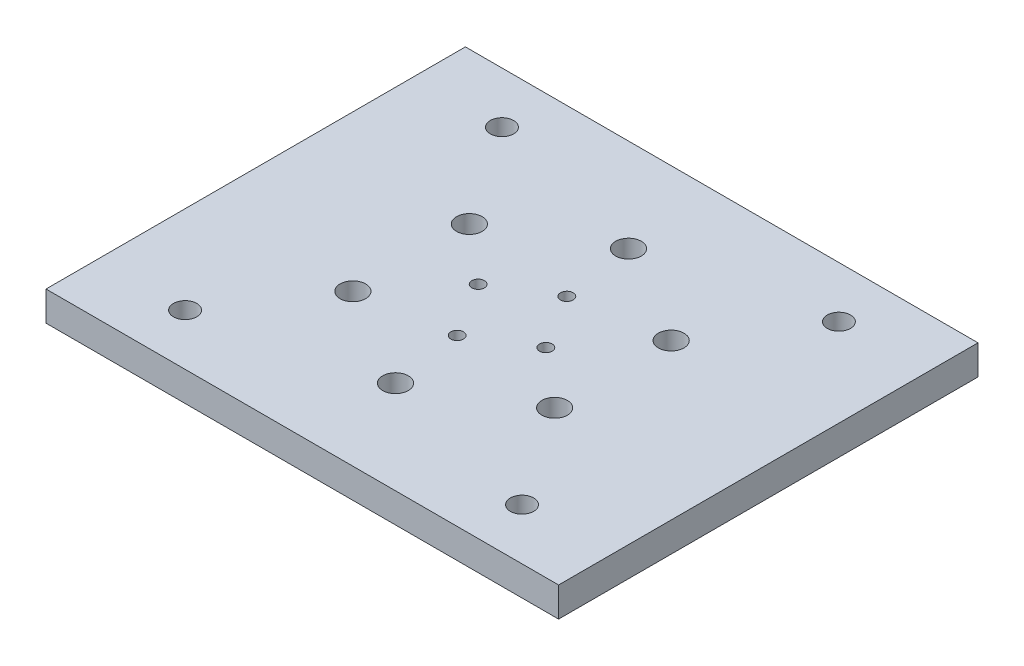
ISO-10303-21;
HEADER;
FILE_DESCRIPTION(('STEP AP214'),'2;1');
FILE_NAME('part.step','',(''),(''),'','','');
FILE_SCHEMA(('AUTOMOTIVE_DESIGN { 1 0 10303 214 1 1 1 1 }'));
ENDSEC;
DATA;
#1=APPLICATION_CONTEXT('core data for automotive mechanical design processes');
#2=APPLICATION_PROTOCOL_DEFINITION('international standard','automotive_design',2000,#1);
#3=PRODUCT_CONTEXT('',#1,'mechanical');
#4=PRODUCT('Part','Part','',(#3));
#5=PRODUCT_RELATED_PRODUCT_CATEGORY('part','',(#4));
#6=PRODUCT_DEFINITION_FORMATION('','',#4);
#7=PRODUCT_DEFINITION_CONTEXT('part definition',#1,'design');
#8=PRODUCT_DEFINITION('design','',#6,#7);
#9=PRODUCT_DEFINITION_SHAPE('','',#8);
#10=(LENGTH_UNIT() NAMED_UNIT(*) SI_UNIT(.MILLI.,.METRE.));
#11=(NAMED_UNIT(*) PLANE_ANGLE_UNIT() SI_UNIT($,.RADIAN.));
#12=(NAMED_UNIT(*) SI_UNIT($,.STERADIAN.) SOLID_ANGLE_UNIT());
#13=UNCERTAINTY_MEASURE_WITH_UNIT(LENGTH_MEASURE(1.E-05),#10,'distance_accuracy_value','');
#14=(GEOMETRIC_REPRESENTATION_CONTEXT(3) GLOBAL_UNCERTAINTY_ASSIGNED_CONTEXT((#13)) GLOBAL_UNIT_ASSIGNED_CONTEXT((#10,
#11,#12)) REPRESENTATION_CONTEXT('',''));
#15=CARTESIAN_POINT('',(0.,0.,0.));
#16=DIRECTION('',(0.,0.,1.));
#17=DIRECTION('',(1.,0.,0.));
#18=AXIS2_PLACEMENT_3D('',#15,#16,#17);
#19=CARTESIAN_POINT('',(110.,6.35,0.));
#20=DIRECTION('',(0.,0.,-1.));
#21=DIRECTION('',(-1.,0.,0.));
#22=AXIS2_PLACEMENT_3D('',#19,#20,#21);
#23=PLANE('',#22);
#24=DIRECTION('',(1.,0.,0.));
#25=VECTOR('',#24,1.);
#26=CARTESIAN_POINT('',(110.,0.,0.));
#27=LINE('',#26,#25);
#28=CARTESIAN_POINT('',(0.,0.,0.));
#29=VERTEX_POINT('',#28);
#30=CARTESIAN_POINT('',(110.,0.,0.));
#31=VERTEX_POINT('',#30);
#32=EDGE_CURVE('E103',#29,#31,#27,.T.);
#33=ORIENTED_EDGE('',*,*,#32,.T.);
#34=DIRECTION('',(0.,-1.,0.));
#35=VECTOR('',#34,1.);
#36=CARTESIAN_POINT('',(110.,6.35,0.));
#37=LINE('',#36,#35);
#38=CARTESIAN_POINT('',(110.,6.35,0.));
#39=VERTEX_POINT('',#38);
#40=EDGE_CURVE('E11',#39,#31,#37,.T.);
#41=ORIENTED_EDGE('',*,*,#40,.F.);
#42=DIRECTION('',(1.,0.,0.));
#43=VECTOR('',#42,1.);
#44=CARTESIAN_POINT('',(110.,6.35,0.));
#45=LINE('',#44,#43);
#46=CARTESIAN_POINT('',(0.,6.35,0.));
#47=VERTEX_POINT('',#46);
#48=EDGE_CURVE('E91',#47,#39,#45,.T.);
#49=ORIENTED_EDGE('',*,*,#48,.F.);
#50=DIRECTION('',(0.,-1.,0.));
#51=VECTOR('',#50,1.);
#52=CARTESIAN_POINT('',(0.,6.35,0.));
#53=LINE('',#52,#51);
#54=EDGE_CURVE('E99',#47,#29,#53,.T.);
#55=ORIENTED_EDGE('',*,*,#54,.T.);
#56=EDGE_LOOP('',(#33,#41,#49,#55));
#57=FACE_BOUND('',#56,.T.);
#58=ADVANCED_FACE('F40',(#57),#23,.F.);
#59=CARTESIAN_POINT('',(110.,6.35,-90.));
#60=DIRECTION('',(-1.,0.,0.));
#61=DIRECTION('',(0.,0.,1.));
#62=AXIS2_PLACEMENT_3D('',#59,#60,#61);
#63=PLANE('',#62);
#64=DIRECTION('',(0.,0.,-1.));
#65=VECTOR('',#64,1.);
#66=CARTESIAN_POINT('',(110.,0.,-90.));
#67=LINE('',#66,#65);
#68=CARTESIAN_POINT('',(110.,0.,-90.));
#69=VERTEX_POINT('',#68);
#70=EDGE_CURVE('E95',#31,#69,#67,.T.);
#71=ORIENTED_EDGE('',*,*,#70,.T.);
#72=DIRECTION('',(0.,-1.,0.));
#73=VECTOR('',#72,1.);
#74=CARTESIAN_POINT('',(110.,6.35,-90.));
#75=LINE('',#74,#73);
#76=CARTESIAN_POINT('',(110.,6.35,-90.));
#77=VERTEX_POINT('',#76);
#78=EDGE_CURVE('E48',#77,#69,#75,.T.);
#79=ORIENTED_EDGE('',*,*,#78,.F.);
#80=DIRECTION('',(0.,0.,-1.));
#81=VECTOR('',#80,1.);
#82=CARTESIAN_POINT('',(110.,6.35,-90.));
#83=LINE('',#82,#81);
#84=EDGE_CURVE('E86',#39,#77,#83,.T.);
#85=ORIENTED_EDGE('',*,*,#84,.F.);
#86=ORIENTED_EDGE('',*,*,#40,.T.);
#87=EDGE_LOOP('',(#71,#79,#85,#86));
#88=FACE_BOUND('',#87,.T.);
#89=ADVANCED_FACE('F94',(#88),#63,.F.);
#90=CARTESIAN_POINT('',(0.,6.35,-90.));
#91=DIRECTION('',(0.,0.,1.));
#92=DIRECTION('',(1.,0.,0.));
#93=AXIS2_PLACEMENT_3D('',#90,#91,#92);
#94=PLANE('',#93);
#95=DIRECTION('',(-1.,0.,0.));
#96=VECTOR('',#95,1.);
#97=CARTESIAN_POINT('',(0.,0.,-90.));
#98=LINE('',#97,#96);
#99=CARTESIAN_POINT('',(0.,0.,-90.));
#100=VERTEX_POINT('',#99);
#101=EDGE_CURVE('E73',#69,#100,#98,.T.);
#102=ORIENTED_EDGE('',*,*,#101,.T.);
#103=DIRECTION('',(0.,-1.,0.));
#104=VECTOR('',#103,1.);
#105=CARTESIAN_POINT('',(0.,6.35,-90.));
#106=LINE('',#105,#104);
#107=CARTESIAN_POINT('',(0.,6.35,-90.));
#108=VERTEX_POINT('',#107);
#109=EDGE_CURVE('E96',#108,#100,#106,.T.);
#110=ORIENTED_EDGE('',*,*,#109,.F.);
#111=DIRECTION('',(-1.,0.,0.));
#112=VECTOR('',#111,1.);
#113=CARTESIAN_POINT('',(0.,6.35,-90.));
#114=LINE('',#113,#112);
#115=EDGE_CURVE('E89',#77,#108,#114,.T.);
#116=ORIENTED_EDGE('',*,*,#115,.F.);
#117=ORIENTED_EDGE('',*,*,#78,.T.);
#118=EDGE_LOOP('',(#102,#110,#116,#117));
#119=FACE_BOUND('',#118,.T.);
#120=ADVANCED_FACE('F97',(#119),#94,.F.);
#121=CARTESIAN_POINT('',(0.,6.35,0.));
#122=DIRECTION('',(1.,0.,0.));
#123=DIRECTION('',(0.,0.,-1.));
#124=AXIS2_PLACEMENT_3D('',#121,#122,#123);
#125=PLANE('',#124);
#126=DIRECTION('',(0.,0.,1.));
#127=VECTOR('',#126,1.);
#128=CARTESIAN_POINT('',(0.,0.,0.));
#129=LINE('',#128,#127);
#130=EDGE_CURVE('E79',#100,#29,#129,.T.);
#131=ORIENTED_EDGE('',*,*,#130,.T.);
#132=ORIENTED_EDGE('',*,*,#54,.F.);
#133=DIRECTION('',(0.,0.,1.));
#134=VECTOR('',#133,1.);
#135=CARTESIAN_POINT('',(0.,6.35,0.));
#136=LINE('',#135,#134);
#137=EDGE_CURVE('E56',#108,#47,#136,.T.);
#138=ORIENTED_EDGE('',*,*,#137,.F.);
#139=ORIENTED_EDGE('',*,*,#109,.T.);
#140=EDGE_LOOP('',(#131,#132,#138,#139));
#141=FACE_BOUND('',#140,.T.);
#142=ADVANCED_FACE('F111',(#141),#125,.F.);
#143=CARTESIAN_POINT('',(0.,6.35,0.));
#144=DIRECTION('',(0.,-1.,0.));
#145=DIRECTION('',(0.,0.,-1.));
#146=AXIS2_PLACEMENT_3D('',#143,#144,#145);
#147=PLANE('',#146);
#148=CARTESIAN_POINT('',(64.5161699743969,6.35,-42.7480341888413));
#149=DIRECTION('',(0.,1.,0.));
#150=DIRECTION('',(0.,0.,1.));
#151=AXIS2_PLACEMENT_3D('',#148,#149,#150);
#152=CIRCLE('',#151,1.355);
#153=CARTESIAN_POINT('',(64.5161699743969,6.35,-41.3930341888413));
#154=VERTEX_POINT('',#153);
#155=EDGE_CURVE('E170',#154,#154,#152,.T.);
#156=ORIENTED_EDGE('',*,*,#155,.F.);
#157=EDGE_LOOP('',(#156));
#158=FACE_BOUND('',#157,.T.);
#159=CARTESIAN_POINT('',(45.4838300246016,6.35,-47.251965808596));
#160=DIRECTION('',(0.,1.,0.));
#161=DIRECTION('',(0.,0.,1.));
#162=AXIS2_PLACEMENT_3D('',#159,#160,#161);
#163=CIRCLE('',#162,1.355);
#164=CARTESIAN_POINT('',(45.4838300246016,6.35,-45.896965808596));
#165=VERTEX_POINT('',#164);
#166=EDGE_CURVE('E189',#165,#165,#163,.T.);
#167=ORIENTED_EDGE('',*,*,#166,.F.);
#168=EDGE_LOOP('',(#167));
#169=FACE_BOUND('',#168,.T.);
#170=CARTESIAN_POINT('',(57.2519658093765,6.35,-54.5161699736163));
#171=DIRECTION('',(0.,1.,0.));
#172=DIRECTION('',(0.,0.,1.));
#173=AXIS2_PLACEMENT_3D('',#170,#171,#172);
#174=CIRCLE('',#173,1.355);
#175=CARTESIAN_POINT('',(57.2519658093765,6.35,-53.1611699736163));
#176=VERTEX_POINT('',#175);
#177=EDGE_CURVE('E183',#176,#176,#174,.T.);
#178=ORIENTED_EDGE('',*,*,#177,.F.);
#179=EDGE_LOOP('',(#178));
#180=FACE_BOUND('',#179,.T.);
#181=CARTESIAN_POINT('',(52.748034189622,6.35,-35.4838300238209));
#182=DIRECTION('',(0.,1.,0.));
#183=DIRECTION('',(0.,0.,1.));
#184=AXIS2_PLACEMENT_3D('',#181,#182,#183);
#185=CIRCLE('',#184,1.355);
#186=CARTESIAN_POINT('',(52.748034189622,6.35,-34.1288300238209));
#187=VERTEX_POINT('',#186);
#188=EDGE_CURVE('E177',#187,#187,#185,.T.);
#189=ORIENTED_EDGE('',*,*,#188,.F.);
#190=EDGE_LOOP('',(#189));
#191=FACE_BOUND('',#190,.T.);
#192=CARTESIAN_POINT('',(55.,6.35,-70.));
#193=DIRECTION('',(0.,1.,0.));
#194=DIRECTION('',(0.,0.,1.));
#195=AXIS2_PLACEMENT_3D('',#192,#193,#194);
#196=CIRCLE('',#195,2.75);
#197=CARTESIAN_POINT('',(55.,6.35,-67.25));
#198=VERTEX_POINT('',#197);
#199=EDGE_CURVE('E127',#198,#198,#196,.T.);
#200=ORIENTED_EDGE('',*,*,#199,.F.);
#201=EDGE_LOOP('',(#200));
#202=FACE_BOUND('',#201,.T.);
#203=CARTESIAN_POINT('',(33.349364905389,6.35,-57.5));
#204=DIRECTION('',(0.,1.,0.));
#205=DIRECTION('',(0.,0.,1.));
#206=AXIS2_PLACEMENT_3D('',#203,#204,#205);
#207=CIRCLE('',#206,2.75);
#208=CARTESIAN_POINT('',(33.349364905389,6.35,-54.75));
#209=VERTEX_POINT('',#208);
#210=EDGE_CURVE('E167',#209,#209,#207,.T.);
#211=ORIENTED_EDGE('',*,*,#210,.F.);
#212=EDGE_LOOP('',(#211));
#213=FACE_BOUND('',#212,.T.);
#214=CARTESIAN_POINT('',(33.349364905389,6.35,-32.5));
#215=DIRECTION('',(0.,1.,0.));
#216=DIRECTION('',(0.,0.,1.));
#217=AXIS2_PLACEMENT_3D('',#214,#215,#216);
#218=CIRCLE('',#217,2.75);
#219=CARTESIAN_POINT('',(33.349364905389,6.35,-29.75));
#220=VERTEX_POINT('',#219);
#221=EDGE_CURVE('E141',#220,#220,#218,.T.);
#222=ORIENTED_EDGE('',*,*,#221,.F.);
#223=EDGE_LOOP('',(#222));
#224=FACE_BOUND('',#223,.T.);
#225=CARTESIAN_POINT('',(55.,6.35,-20.));
#226=DIRECTION('',(0.,1.,0.));
#227=DIRECTION('',(0.,0.,1.));
#228=AXIS2_PLACEMENT_3D('',#225,#226,#227);
#229=CIRCLE('',#228,2.75);
#230=CARTESIAN_POINT('',(55.,6.35,-17.25));
#231=VERTEX_POINT('',#230);
#232=EDGE_CURVE('E148',#231,#231,#229,.T.);
#233=ORIENTED_EDGE('',*,*,#232,.F.);
#234=EDGE_LOOP('',(#233));
#235=FACE_BOUND('',#234,.T.);
#236=CARTESIAN_POINT('',(76.6506350946109,6.35,-32.5));
#237=DIRECTION('',(0.,1.,0.));
#238=DIRECTION('',(0.,0.,1.));
#239=AXIS2_PLACEMENT_3D('',#236,#237,#238);
#240=CIRCLE('',#239,2.75000000000001);
#241=CARTESIAN_POINT('',(76.6506350946109,6.35,-29.75));
#242=VERTEX_POINT('',#241);
#243=EDGE_CURVE('E154',#242,#242,#240,.T.);
#244=ORIENTED_EDGE('',*,*,#243,.F.);
#245=EDGE_LOOP('',(#244));
#246=FACE_BOUND('',#245,.T.);
#247=CARTESIAN_POINT('',(76.6506350946109,6.35,-57.5));
#248=DIRECTION('',(0.,1.,0.));
#249=DIRECTION('',(0.,0.,1.));
#250=AXIS2_PLACEMENT_3D('',#247,#248,#249);
#251=CIRCLE('',#250,2.75000000000001);
#252=CARTESIAN_POINT('',(76.6506350946109,6.35,-54.75));
#253=VERTEX_POINT('',#252);
#254=EDGE_CURVE('E160',#253,#253,#251,.T.);
#255=ORIENTED_EDGE('',*,*,#254,.F.);
#256=EDGE_LOOP('',(#255));
#257=FACE_BOUND('',#256,.T.);
#258=CARTESIAN_POINT('',(91.1499999999999,6.35,-79.));
#259=DIRECTION('',(0.,1.,0.));
#260=DIRECTION('',(0.,0.,-1.));
#261=AXIS2_PLACEMENT_3D('',#258,#259,#260);
#262=CIRCLE('',#261,2.5);
#263=CARTESIAN_POINT('',(91.1499999999999,6.35,-81.5));
#264=VERTEX_POINT('',#263);
#265=EDGE_CURVE('E126',#264,#264,#262,.T.);
#266=ORIENTED_EDGE('',*,*,#265,.F.);
#267=EDGE_LOOP('',(#266));
#268=FACE_BOUND('',#267,.T.);
#269=CARTESIAN_POINT('',(91.15,6.35,-11.));
#270=DIRECTION('',(0.,1.,0.));
#271=DIRECTION('',(0.,0.,1.));
#272=AXIS2_PLACEMENT_3D('',#269,#270,#271);
#273=CIRCLE('',#272,2.50000000000001);
#274=CARTESIAN_POINT('',(91.15,6.35,-8.50000000000001));
#275=VERTEX_POINT('',#274);
#276=EDGE_CURVE('E133',#275,#275,#273,.T.);
#277=ORIENTED_EDGE('',*,*,#276,.F.);
#278=EDGE_LOOP('',(#277));
#279=FACE_BOUND('',#278,.T.);
#280=CARTESIAN_POINT('',(18.85,6.35,-11.));
#281=DIRECTION('',(0.,1.,0.));
#282=DIRECTION('',(0.,0.,-1.));
#283=AXIS2_PLACEMENT_3D('',#280,#281,#282);
#284=CIRCLE('',#283,2.5);
#285=CARTESIAN_POINT('',(18.85,6.35,-13.5));
#286=VERTEX_POINT('',#285);
#287=EDGE_CURVE('E120',#286,#286,#284,.T.);
#288=ORIENTED_EDGE('',*,*,#287,.F.);
#289=EDGE_LOOP('',(#288));
#290=FACE_BOUND('',#289,.T.);
#291=CARTESIAN_POINT('',(18.85,6.35,-79.));
#292=DIRECTION('',(0.,1.,0.));
#293=DIRECTION('',(0.,0.,1.));
#294=AXIS2_PLACEMENT_3D('',#291,#292,#293);
#295=CIRCLE('',#294,2.5);
#296=CARTESIAN_POINT('',(18.85,6.35,-76.5));
#297=VERTEX_POINT('',#296);
#298=EDGE_CURVE('E117',#297,#297,#295,.T.);
#299=ORIENTED_EDGE('',*,*,#298,.F.);
#300=EDGE_LOOP('',(#299));
#301=FACE_BOUND('',#300,.T.);
#302=ORIENTED_EDGE('',*,*,#48,.T.);
#303=ORIENTED_EDGE('',*,*,#84,.T.);
#304=ORIENTED_EDGE('',*,*,#115,.T.);
#305=ORIENTED_EDGE('',*,*,#137,.T.);
#306=EDGE_LOOP('',(#302,#303,#304,#305));
#307=FACE_BOUND('',#306,.T.);
#308=ADVANCED_FACE('F87',(#158,#169,#180,#191,#202,#213,#224,#235,#246,#257,#268,#279,#290,#301,
#307),#147,.F.);
#309=CARTESIAN_POINT('',(0.,0.,0.));
#310=DIRECTION('',(0.,-1.,0.));
#311=DIRECTION('',(0.,0.,-1.));
#312=AXIS2_PLACEMENT_3D('',#309,#310,#311);
#313=PLANE('',#312);
#314=CARTESIAN_POINT('',(64.5161699743969,0.,-42.7480341888413));
#315=DIRECTION('',(0.,-1.,0.));
#316=DIRECTION('',(0.,0.,-1.));
#317=AXIS2_PLACEMENT_3D('',#314,#315,#316);
#318=CIRCLE('',#317,1.355);
#319=CARTESIAN_POINT('',(64.5161699743969,0.,-44.1030341888413));
#320=VERTEX_POINT('',#319);
#321=EDGE_CURVE('E195',#320,#320,#318,.F.);
#322=ORIENTED_EDGE('',*,*,#321,.T.);
#323=EDGE_LOOP('',(#322));
#324=FACE_BOUND('',#323,.T.);
#325=CARTESIAN_POINT('',(45.4838300246016,0.,-47.251965808596));
#326=DIRECTION('',(0.,-1.,0.));
#327=DIRECTION('',(0.,0.,-1.));
#328=AXIS2_PLACEMENT_3D('',#325,#326,#327);
#329=CIRCLE('',#328,1.355);
#330=CARTESIAN_POINT('',(45.4838300246016,0.,-48.606965808596));
#331=VERTEX_POINT('',#330);
#332=EDGE_CURVE('E192',#331,#331,#329,.F.);
#333=ORIENTED_EDGE('',*,*,#332,.T.);
#334=EDGE_LOOP('',(#333));
#335=FACE_BOUND('',#334,.T.);
#336=CARTESIAN_POINT('',(57.2519658093765,0.,-54.5161699736163));
#337=DIRECTION('',(0.,-1.,0.));
#338=DIRECTION('',(0.,0.,-1.));
#339=AXIS2_PLACEMENT_3D('',#336,#337,#338);
#340=CIRCLE('',#339,1.355);
#341=CARTESIAN_POINT('',(57.2519658093765,0.,-55.8711699736163));
#342=VERTEX_POINT('',#341);
#343=EDGE_CURVE('E186',#342,#342,#340,.F.);
#344=ORIENTED_EDGE('',*,*,#343,.T.);
#345=EDGE_LOOP('',(#344));
#346=FACE_BOUND('',#345,.T.);
#347=CARTESIAN_POINT('',(52.748034189622,0.,-35.4838300238209));
#348=DIRECTION('',(0.,-1.,0.));
#349=DIRECTION('',(0.,0.,-1.));
#350=AXIS2_PLACEMENT_3D('',#347,#348,#349);
#351=CIRCLE('',#350,1.355);
#352=CARTESIAN_POINT('',(52.748034189622,0.,-36.8388300238209));
#353=VERTEX_POINT('',#352);
#354=EDGE_CURVE('E180',#353,#353,#351,.F.);
#355=ORIENTED_EDGE('',*,*,#354,.T.);
#356=EDGE_LOOP('',(#355));
#357=FACE_BOUND('',#356,.T.);
#358=CARTESIAN_POINT('',(55.,0.,-70.));
#359=DIRECTION('',(0.,-1.,0.));
#360=DIRECTION('',(0.,0.,-1.));
#361=AXIS2_PLACEMENT_3D('',#358,#359,#360);
#362=CIRCLE('',#361,2.75);
#363=CARTESIAN_POINT('',(55.,0.,-72.75));
#364=VERTEX_POINT('',#363);
#365=EDGE_CURVE('E166',#364,#364,#362,.F.);
#366=ORIENTED_EDGE('',*,*,#365,.T.);
#367=EDGE_LOOP('',(#366));
#368=FACE_BOUND('',#367,.T.);
#369=CARTESIAN_POINT('',(33.349364905389,0.,-57.5));
#370=DIRECTION('',(0.,-1.,0.));
#371=DIRECTION('',(0.,0.,-1.));
#372=AXIS2_PLACEMENT_3D('',#369,#370,#371);
#373=CIRCLE('',#372,2.75);
#374=CARTESIAN_POINT('',(33.349364905389,0.,-60.25));
#375=VERTEX_POINT('',#374);
#376=EDGE_CURVE('E145',#375,#375,#373,.F.);
#377=ORIENTED_EDGE('',*,*,#376,.T.);
#378=EDGE_LOOP('',(#377));
#379=FACE_BOUND('',#378,.T.);
#380=CARTESIAN_POINT('',(33.349364905389,0.,-32.5));
#381=DIRECTION('',(0.,-1.,0.));
#382=DIRECTION('',(0.,0.,-1.));
#383=AXIS2_PLACEMENT_3D('',#380,#381,#382);
#384=CIRCLE('',#383,2.75);
#385=CARTESIAN_POINT('',(33.349364905389,0.,-35.25));
#386=VERTEX_POINT('',#385);
#387=EDGE_CURVE('E144',#386,#386,#384,.F.);
#388=ORIENTED_EDGE('',*,*,#387,.T.);
#389=EDGE_LOOP('',(#388));
#390=FACE_BOUND('',#389,.T.);
#391=CARTESIAN_POINT('',(55.,0.,-20.));
#392=DIRECTION('',(0.,-1.,0.));
#393=DIRECTION('',(0.,0.,-1.));
#394=AXIS2_PLACEMENT_3D('',#391,#392,#393);
#395=CIRCLE('',#394,2.75);
#396=CARTESIAN_POINT('',(55.,0.,-22.75));
#397=VERTEX_POINT('',#396);
#398=EDGE_CURVE('E151',#397,#397,#395,.F.);
#399=ORIENTED_EDGE('',*,*,#398,.T.);
#400=EDGE_LOOP('',(#399));
#401=FACE_BOUND('',#400,.T.);
#402=CARTESIAN_POINT('',(76.6506350946109,0.,-32.5));
#403=DIRECTION('',(0.,-1.,0.));
#404=DIRECTION('',(0.,0.,-1.));
#405=AXIS2_PLACEMENT_3D('',#402,#403,#404);
#406=CIRCLE('',#405,2.75000000000001);
#407=CARTESIAN_POINT('',(76.6506350946109,0.,-35.25));
#408=VERTEX_POINT('',#407);
#409=EDGE_CURVE('E157',#408,#408,#406,.F.);
#410=ORIENTED_EDGE('',*,*,#409,.T.);
#411=EDGE_LOOP('',(#410));
#412=FACE_BOUND('',#411,.T.);
#413=CARTESIAN_POINT('',(76.6506350946109,0.,-57.5));
#414=DIRECTION('',(0.,-1.,0.));
#415=DIRECTION('',(0.,0.,-1.));
#416=AXIS2_PLACEMENT_3D('',#413,#414,#415);
#417=CIRCLE('',#416,2.75000000000001);
#418=CARTESIAN_POINT('',(76.6506350946109,0.,-60.25));
#419=VERTEX_POINT('',#418);
#420=EDGE_CURVE('E163',#419,#419,#417,.F.);
#421=ORIENTED_EDGE('',*,*,#420,.T.);
#422=EDGE_LOOP('',(#421));
#423=FACE_BOUND('',#422,.T.);
#424=CARTESIAN_POINT('',(91.1499999999999,0.,-79.));
#425=DIRECTION('',(0.,1.,0.));
#426=DIRECTION('',(0.,0.,-1.));
#427=AXIS2_PLACEMENT_3D('',#424,#425,#426);
#428=CIRCLE('',#427,2.5);
#429=CARTESIAN_POINT('',(91.1499999999999,0.,-81.5));
#430=VERTEX_POINT('',#429);
#431=EDGE_CURVE('E123',#430,#430,#428,.T.);
#432=ORIENTED_EDGE('',*,*,#431,.T.);
#433=EDGE_LOOP('',(#432));
#434=FACE_BOUND('',#433,.T.);
#435=CARTESIAN_POINT('',(91.15,0.,-11.));
#436=DIRECTION('',(0.,1.,0.));
#437=DIRECTION('',(0.,0.,1.));
#438=AXIS2_PLACEMENT_3D('',#435,#436,#437);
#439=CIRCLE('',#438,2.50000000000001);
#440=CARTESIAN_POINT('',(91.15,0.,-8.50000000000001));
#441=VERTEX_POINT('',#440);
#442=EDGE_CURVE('E130',#441,#441,#439,.T.);
#443=ORIENTED_EDGE('',*,*,#442,.T.);
#444=EDGE_LOOP('',(#443));
#445=FACE_BOUND('',#444,.T.);
#446=CARTESIAN_POINT('',(18.85,0.,-11.));
#447=DIRECTION('',(0.,1.,0.));
#448=DIRECTION('',(0.,0.,-1.));
#449=AXIS2_PLACEMENT_3D('',#446,#447,#448);
#450=CIRCLE('',#449,2.5);
#451=CARTESIAN_POINT('',(18.85,0.,-13.5));
#452=VERTEX_POINT('',#451);
#453=EDGE_CURVE('E136',#452,#452,#450,.T.);
#454=ORIENTED_EDGE('',*,*,#453,.T.);
#455=EDGE_LOOP('',(#454));
#456=FACE_BOUND('',#455,.T.);
#457=CARTESIAN_POINT('',(18.85,0.,-79.));
#458=DIRECTION('',(0.,1.,0.));
#459=DIRECTION('',(0.,0.,1.));
#460=AXIS2_PLACEMENT_3D('',#457,#458,#459);
#461=CIRCLE('',#460,2.5);
#462=CARTESIAN_POINT('',(18.85,0.,-76.5));
#463=VERTEX_POINT('',#462);
#464=EDGE_CURVE('E106',#463,#463,#461,.T.);
#465=ORIENTED_EDGE('',*,*,#464,.T.);
#466=EDGE_LOOP('',(#465));
#467=FACE_BOUND('',#466,.T.);
#468=ORIENTED_EDGE('',*,*,#32,.F.);
#469=ORIENTED_EDGE('',*,*,#130,.F.);
#470=ORIENTED_EDGE('',*,*,#101,.F.);
#471=ORIENTED_EDGE('',*,*,#70,.F.);
#472=EDGE_LOOP('',(#468,#469,#470,#471));
#473=FACE_BOUND('',#472,.T.);
#474=ADVANCED_FACE('F114',(#324,#335,#346,#357,#368,#379,#390,#401,#412,#423,#434,#445,#456,
#467,#473),#313,.T.);
#475=CARTESIAN_POINT('',(18.85,0.,-79.));
#476=DIRECTION('',(0.,1.,0.));
#477=DIRECTION('',(0.,0.,1.));
#478=AXIS2_PLACEMENT_3D('',#475,#476,#477);
#479=CYLINDRICAL_SURFACE('',#478,2.5);
#480=ORIENTED_EDGE('',*,*,#464,.F.);
#481=EDGE_LOOP('',(#480));
#482=FACE_BOUND('',#481,.T.);
#483=ORIENTED_EDGE('',*,*,#298,.T.);
#484=EDGE_LOOP('',(#483));
#485=FACE_BOUND('',#484,.T.);
#486=ADVANCED_FACE('F232',(#482,#485),#479,.F.);
#487=CARTESIAN_POINT('',(18.85,0.,-11.));
#488=DIRECTION('',(0.,1.,0.));
#489=DIRECTION('',(0.,0.,1.));
#490=AXIS2_PLACEMENT_3D('',#487,#488,#489);
#491=CYLINDRICAL_SURFACE('',#490,2.5);
#492=ORIENTED_EDGE('',*,*,#453,.F.);
#493=EDGE_LOOP('',(#492));
#494=FACE_BOUND('',#493,.T.);
#495=ORIENTED_EDGE('',*,*,#287,.T.);
#496=EDGE_LOOP('',(#495));
#497=FACE_BOUND('',#496,.T.);
#498=ADVANCED_FACE('F234',(#494,#497),#491,.F.);
#499=CARTESIAN_POINT('',(91.15,0.,-11.));
#500=DIRECTION('',(0.,1.,0.));
#501=DIRECTION('',(0.,0.,1.));
#502=AXIS2_PLACEMENT_3D('',#499,#500,#501);
#503=CYLINDRICAL_SURFACE('',#502,2.50000000000001);
#504=ORIENTED_EDGE('',*,*,#442,.F.);
#505=EDGE_LOOP('',(#504));
#506=FACE_BOUND('',#505,.T.);
#507=ORIENTED_EDGE('',*,*,#276,.T.);
#508=EDGE_LOOP('',(#507));
#509=FACE_BOUND('',#508,.T.);
#510=ADVANCED_FACE('F241',(#506,#509),#503,.F.);
#511=CARTESIAN_POINT('',(91.1499999999999,0.,-79.));
#512=DIRECTION('',(0.,1.,0.));
#513=DIRECTION('',(0.,0.,1.));
#514=AXIS2_PLACEMENT_3D('',#511,#512,#513);
#515=CYLINDRICAL_SURFACE('',#514,2.5);
#516=ORIENTED_EDGE('',*,*,#431,.F.);
#517=EDGE_LOOP('',(#516));
#518=FACE_BOUND('',#517,.T.);
#519=ORIENTED_EDGE('',*,*,#265,.T.);
#520=EDGE_LOOP('',(#519));
#521=FACE_BOUND('',#520,.T.);
#522=ADVANCED_FACE('F302',(#518,#521),#515,.F.);
#523=CARTESIAN_POINT('',(76.6506350946109,-0.00100000000000013,-57.5));
#524=DIRECTION('',(0.,1.,0.));
#525=DIRECTION('',(0.,0.,1.));
#526=AXIS2_PLACEMENT_3D('',#523,#524,#525);
#527=CYLINDRICAL_SURFACE('',#526,2.75000000000001);
#528=ORIENTED_EDGE('',*,*,#420,.F.);
#529=EDGE_LOOP('',(#528));
#530=FACE_BOUND('',#529,.T.);
#531=ORIENTED_EDGE('',*,*,#254,.T.);
#532=EDGE_LOOP('',(#531));
#533=FACE_BOUND('',#532,.T.);
#534=ADVANCED_FACE('F311',(#530,#533),#527,.F.);
#535=CARTESIAN_POINT('',(76.6506350946109,-0.00100000000000013,-32.5));
#536=DIRECTION('',(0.,1.,0.));
#537=DIRECTION('',(0.,0.,1.));
#538=AXIS2_PLACEMENT_3D('',#535,#536,#537);
#539=CYLINDRICAL_SURFACE('',#538,2.75000000000001);
#540=ORIENTED_EDGE('',*,*,#409,.F.);
#541=EDGE_LOOP('',(#540));
#542=FACE_BOUND('',#541,.T.);
#543=ORIENTED_EDGE('',*,*,#243,.T.);
#544=EDGE_LOOP('',(#543));
#545=FACE_BOUND('',#544,.T.);
#546=ADVANCED_FACE('F319',(#542,#545),#539,.F.);
#547=CARTESIAN_POINT('',(55.,-0.00100000000000013,-20.));
#548=DIRECTION('',(0.,1.,0.));
#549=DIRECTION('',(0.,0.,1.));
#550=AXIS2_PLACEMENT_3D('',#547,#548,#549);
#551=CYLINDRICAL_SURFACE('',#550,2.75);
#552=ORIENTED_EDGE('',*,*,#398,.F.);
#553=EDGE_LOOP('',(#552));
#554=FACE_BOUND('',#553,.T.);
#555=ORIENTED_EDGE('',*,*,#232,.T.);
#556=EDGE_LOOP('',(#555));
#557=FACE_BOUND('',#556,.T.);
#558=ADVANCED_FACE('F328',(#554,#557),#551,.F.);
#559=CARTESIAN_POINT('',(33.349364905389,-0.00100000000000013,-32.5));
#560=DIRECTION('',(0.,1.,0.));
#561=DIRECTION('',(0.,0.,1.));
#562=AXIS2_PLACEMENT_3D('',#559,#560,#561);
#563=CYLINDRICAL_SURFACE('',#562,2.75);
#564=ORIENTED_EDGE('',*,*,#387,.F.);
#565=EDGE_LOOP('',(#564));
#566=FACE_BOUND('',#565,.T.);
#567=ORIENTED_EDGE('',*,*,#221,.T.);
#568=EDGE_LOOP('',(#567));
#569=FACE_BOUND('',#568,.T.);
#570=ADVANCED_FACE('F337',(#566,#569),#563,.F.);
#571=CARTESIAN_POINT('',(33.349364905389,-0.00100000000000013,-57.5));
#572=DIRECTION('',(0.,1.,0.));
#573=DIRECTION('',(0.,0.,1.));
#574=AXIS2_PLACEMENT_3D('',#571,#572,#573);
#575=CYLINDRICAL_SURFACE('',#574,2.75);
#576=ORIENTED_EDGE('',*,*,#376,.F.);
#577=EDGE_LOOP('',(#576));
#578=FACE_BOUND('',#577,.T.);
#579=ORIENTED_EDGE('',*,*,#210,.T.);
#580=EDGE_LOOP('',(#579));
#581=FACE_BOUND('',#580,.T.);
#582=ADVANCED_FACE('F346',(#578,#581),#575,.F.);
#583=CARTESIAN_POINT('',(55.,-0.00100000000000013,-70.));
#584=DIRECTION('',(0.,1.,0.));
#585=DIRECTION('',(0.,0.,1.));
#586=AXIS2_PLACEMENT_3D('',#583,#584,#585);
#587=CYLINDRICAL_SURFACE('',#586,2.75);
#588=ORIENTED_EDGE('',*,*,#365,.F.);
#589=EDGE_LOOP('',(#588));
#590=FACE_BOUND('',#589,.T.);
#591=ORIENTED_EDGE('',*,*,#199,.T.);
#592=EDGE_LOOP('',(#591));
#593=FACE_BOUND('',#592,.T.);
#594=ADVANCED_FACE('F355',(#590,#593),#587,.F.);
#595=CARTESIAN_POINT('',(52.748034189622,-0.00100000000000013,-35.4838300238209));
#596=DIRECTION('',(0.,1.,0.));
#597=DIRECTION('',(0.,0.,1.));
#598=AXIS2_PLACEMENT_3D('',#595,#596,#597);
#599=CYLINDRICAL_SURFACE('',#598,1.355);
#600=ORIENTED_EDGE('',*,*,#354,.F.);
#601=EDGE_LOOP('',(#600));
#602=FACE_BOUND('',#601,.T.);
#603=ORIENTED_EDGE('',*,*,#188,.T.);
#604=EDGE_LOOP('',(#603));
#605=FACE_BOUND('',#604,.T.);
#606=ADVANCED_FACE('F364',(#602,#605),#599,.F.);
#607=CARTESIAN_POINT('',(57.2519658093765,-0.00100000000000013,-54.5161699736163));
#608=DIRECTION('',(0.,1.,0.));
#609=DIRECTION('',(0.,0.,1.));
#610=AXIS2_PLACEMENT_3D('',#607,#608,#609);
#611=CYLINDRICAL_SURFACE('',#610,1.355);
#612=ORIENTED_EDGE('',*,*,#343,.F.);
#613=EDGE_LOOP('',(#612));
#614=FACE_BOUND('',#613,.T.);
#615=ORIENTED_EDGE('',*,*,#177,.T.);
#616=EDGE_LOOP('',(#615));
#617=FACE_BOUND('',#616,.T.);
#618=ADVANCED_FACE('F373',(#614,#617),#611,.F.);
#619=CARTESIAN_POINT('',(45.4838300246016,-0.00100000000000013,-47.251965808596));
#620=DIRECTION('',(0.,1.,0.));
#621=DIRECTION('',(0.,0.,1.));
#622=AXIS2_PLACEMENT_3D('',#619,#620,#621);
#623=CYLINDRICAL_SURFACE('',#622,1.355);
#624=ORIENTED_EDGE('',*,*,#332,.F.);
#625=EDGE_LOOP('',(#624));
#626=FACE_BOUND('',#625,.T.);
#627=ORIENTED_EDGE('',*,*,#166,.T.);
#628=EDGE_LOOP('',(#627));
#629=FACE_BOUND('',#628,.T.);
#630=ADVANCED_FACE('F382',(#626,#629),#623,.F.);
#631=CARTESIAN_POINT('',(64.5161699743969,-0.00100000000000013,-42.7480341888413));
#632=DIRECTION('',(0.,1.,0.));
#633=DIRECTION('',(0.,0.,1.));
#634=AXIS2_PLACEMENT_3D('',#631,#632,#633);
#635=CYLINDRICAL_SURFACE('',#634,1.355);
#636=ORIENTED_EDGE('',*,*,#321,.F.);
#637=EDGE_LOOP('',(#636));
#638=FACE_BOUND('',#637,.T.);
#639=ORIENTED_EDGE('',*,*,#155,.T.);
#640=EDGE_LOOP('',(#639));
#641=FACE_BOUND('',#640,.T.);
#642=ADVANCED_FACE('F201',(#638,#641),#635,.F.);
#643=CLOSED_SHELL('',(#58,#89,#120,#142,#308,#474,#486,#498,#510,#522,#534,#546,#558,#570,#582,
#594,#606,#618,#630,#642));
#644=MANIFOLD_SOLID_BREP('B2',#643);
#645=ADVANCED_BREP_SHAPE_REPRESENTATION('',(#18,#644),#14);
#646=SHAPE_DEFINITION_REPRESENTATION(#9,#645);
ENDSEC;
END-ISO-10303-21;
